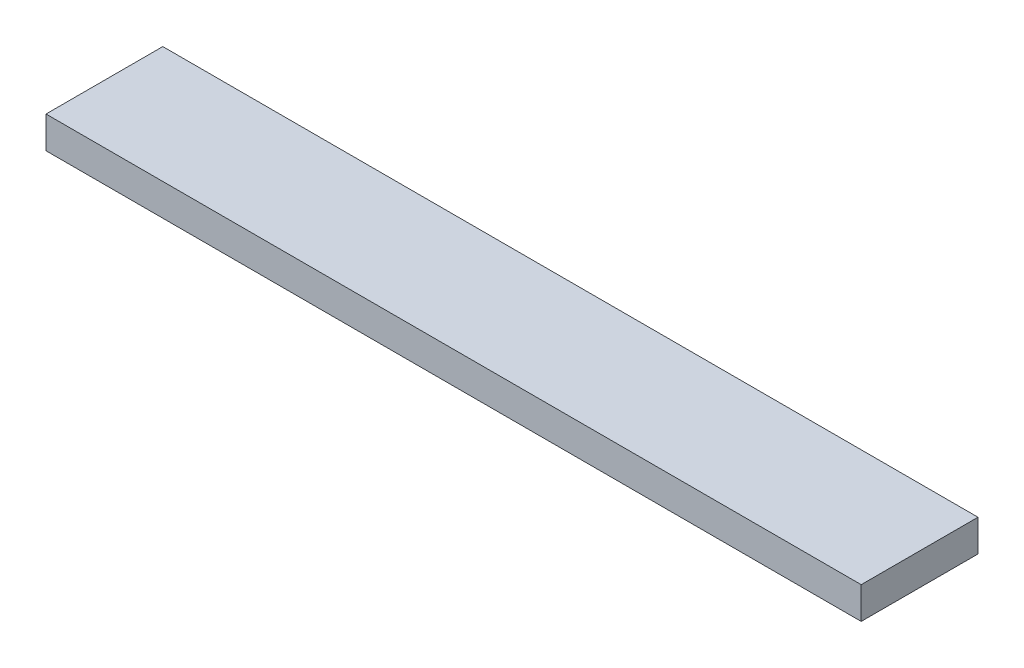
ISO-10303-21;
HEADER;
FILE_DESCRIPTION(('STEP AP214'),'2;1');
FILE_NAME('part.step','',(''),(''),'','','');
FILE_SCHEMA(('AUTOMOTIVE_DESIGN { 1 0 10303 214 1 1 1 1 }'));
ENDSEC;
DATA;
#1=APPLICATION_CONTEXT('core data for automotive mechanical design processes');
#2=APPLICATION_PROTOCOL_DEFINITION('international standard','automotive_design',2000,#1);
#3=PRODUCT_CONTEXT('',#1,'mechanical');
#4=PRODUCT('Part','Part','',(#3));
#5=PRODUCT_RELATED_PRODUCT_CATEGORY('part','',(#4));
#6=PRODUCT_DEFINITION_FORMATION('','',#4);
#7=PRODUCT_DEFINITION_CONTEXT('part definition',#1,'design');
#8=PRODUCT_DEFINITION('design','',#6,#7);
#9=PRODUCT_DEFINITION_SHAPE('','',#8);
#10=(LENGTH_UNIT() NAMED_UNIT(*) SI_UNIT(.MILLI.,.METRE.));
#11=(NAMED_UNIT(*) PLANE_ANGLE_UNIT() SI_UNIT($,.RADIAN.));
#12=(NAMED_UNIT(*) SI_UNIT($,.STERADIAN.) SOLID_ANGLE_UNIT());
#13=UNCERTAINTY_MEASURE_WITH_UNIT(LENGTH_MEASURE(1.E-05),#10,'distance_accuracy_value','');
#14=(GEOMETRIC_REPRESENTATION_CONTEXT(3) GLOBAL_UNCERTAINTY_ASSIGNED_CONTEXT((#13)) GLOBAL_UNIT_ASSIGNED_CONTEXT((#10,
#11,#12)) REPRESENTATION_CONTEXT('',''));
#15=CARTESIAN_POINT('',(0.,0.,0.));
#16=DIRECTION('',(0.,0.,1.));
#17=DIRECTION('',(1.,0.,0.));
#18=AXIS2_PLACEMENT_3D('',#15,#16,#17);
#19=CARTESIAN_POINT('',(0.,38.1,0.));
#20=DIRECTION('',(1.,0.,0.));
#21=DIRECTION('',(0.,0.,-1.));
#22=AXIS2_PLACEMENT_3D('',#19,#20,#21);
#23=PLANE('',#22);
#24=DIRECTION('',(0.,0.,1.));
#25=VECTOR('',#24,1.);
#26=CARTESIAN_POINT('',(0.,0.,0.));
#27=LINE('',#26,#25);
#28=CARTESIAN_POINT('',(0.,0.,-139.7));
#29=VERTEX_POINT('',#28);
#30=CARTESIAN_POINT('',(0.,0.,0.));
#31=VERTEX_POINT('',#30);
#32=EDGE_CURVE('E97',#29,#31,#27,.T.);
#33=ORIENTED_EDGE('',*,*,#32,.T.);
#34=DIRECTION('',(0.,-1.,0.));
#35=VECTOR('',#34,1.);
#36=CARTESIAN_POINT('',(0.,38.1,0.));
#37=LINE('',#36,#35);
#38=CARTESIAN_POINT('',(0.,38.1,0.));
#39=VERTEX_POINT('',#38);
#40=EDGE_CURVE('E11',#39,#31,#37,.T.);
#41=ORIENTED_EDGE('',*,*,#40,.F.);
#42=DIRECTION('',(0.,0.,1.));
#43=VECTOR('',#42,1.);
#44=CARTESIAN_POINT('',(0.,38.1,0.));
#45=LINE('',#44,#43);
#46=CARTESIAN_POINT('',(0.,38.1,-139.7));
#47=VERTEX_POINT('',#46);
#48=EDGE_CURVE('E85',#47,#39,#45,.T.);
#49=ORIENTED_EDGE('',*,*,#48,.F.);
#50=DIRECTION('',(0.,-1.,0.));
#51=VECTOR('',#50,1.);
#52=CARTESIAN_POINT('',(0.,38.1,-139.7));
#53=LINE('',#52,#51);
#54=EDGE_CURVE('E93',#47,#29,#53,.T.);
#55=ORIENTED_EDGE('',*,*,#54,.T.);
#56=EDGE_LOOP('',(#33,#41,#49,#55));
#57=FACE_BOUND('',#56,.T.);
#58=ADVANCED_FACE('F34',(#57),#23,.F.);
#59=CARTESIAN_POINT('',(0.,38.1,0.));
#60=DIRECTION('',(0.,0.,-1.));
#61=DIRECTION('',(-1.,0.,0.));
#62=AXIS2_PLACEMENT_3D('',#59,#60,#61);
#63=PLANE('',#62);
#64=DIRECTION('',(1.,0.,0.));
#65=VECTOR('',#64,1.);
#66=CARTESIAN_POINT('',(0.,0.,0.));
#67=LINE('',#66,#65);
#68=CARTESIAN_POINT('',(975.,0.,0.));
#69=VERTEX_POINT('',#68);
#70=EDGE_CURVE('E89',#31,#69,#67,.T.);
#71=ORIENTED_EDGE('',*,*,#70,.T.);
#72=DIRECTION('',(0.,-1.,0.));
#73=VECTOR('',#72,1.);
#74=CARTESIAN_POINT('',(975.,38.1,0.));
#75=LINE('',#74,#73);
#76=CARTESIAN_POINT('',(975.,38.1,0.));
#77=VERTEX_POINT('',#76);
#78=EDGE_CURVE('E42',#77,#69,#75,.T.);
#79=ORIENTED_EDGE('',*,*,#78,.F.);
#80=DIRECTION('',(1.,0.,0.));
#81=VECTOR('',#80,1.);
#82=CARTESIAN_POINT('',(0.,38.1,0.));
#83=LINE('',#82,#81);
#84=EDGE_CURVE('E80',#39,#77,#83,.T.);
#85=ORIENTED_EDGE('',*,*,#84,.F.);
#86=ORIENTED_EDGE('',*,*,#40,.T.);
#87=EDGE_LOOP('',(#71,#79,#85,#86));
#88=FACE_BOUND('',#87,.T.);
#89=ADVANCED_FACE('F88',(#88),#63,.F.);
#90=CARTESIAN_POINT('',(975.,38.1,0.));
#91=DIRECTION('',(-1.,0.,0.));
#92=DIRECTION('',(0.,0.,1.));
#93=AXIS2_PLACEMENT_3D('',#90,#91,#92);
#94=PLANE('',#93);
#95=DIRECTION('',(0.,0.,-1.));
#96=VECTOR('',#95,1.);
#97=CARTESIAN_POINT('',(975.,0.,0.));
#98=LINE('',#97,#96);
#99=CARTESIAN_POINT('',(975.,0.,-139.7));
#100=VERTEX_POINT('',#99);
#101=EDGE_CURVE('E67',#69,#100,#98,.T.);
#102=ORIENTED_EDGE('',*,*,#101,.T.);
#103=DIRECTION('',(0.,-1.,0.));
#104=VECTOR('',#103,1.);
#105=CARTESIAN_POINT('',(975.,38.1,-139.7));
#106=LINE('',#105,#104);
#107=CARTESIAN_POINT('',(975.,38.1,-139.7));
#108=VERTEX_POINT('',#107);
#109=EDGE_CURVE('E90',#108,#100,#106,.T.);
#110=ORIENTED_EDGE('',*,*,#109,.F.);
#111=DIRECTION('',(0.,0.,-1.));
#112=VECTOR('',#111,1.);
#113=CARTESIAN_POINT('',(975.,38.1,0.));
#114=LINE('',#113,#112);
#115=EDGE_CURVE('E83',#77,#108,#114,.T.);
#116=ORIENTED_EDGE('',*,*,#115,.F.);
#117=ORIENTED_EDGE('',*,*,#78,.T.);
#118=EDGE_LOOP('',(#102,#110,#116,#117));
#119=FACE_BOUND('',#118,.T.);
#120=ADVANCED_FACE('F91',(#119),#94,.F.);
#121=CARTESIAN_POINT('',(0.,38.1,-139.7));
#122=DIRECTION('',(0.,0.,1.));
#123=DIRECTION('',(1.,0.,0.));
#124=AXIS2_PLACEMENT_3D('',#121,#122,#123);
#125=PLANE('',#124);
#126=DIRECTION('',(-1.,0.,0.));
#127=VECTOR('',#126,1.);
#128=CARTESIAN_POINT('',(0.,0.,-139.7));
#129=LINE('',#128,#127);
#130=EDGE_CURVE('E73',#100,#29,#129,.T.);
#131=ORIENTED_EDGE('',*,*,#130,.T.);
#132=ORIENTED_EDGE('',*,*,#54,.F.);
#133=DIRECTION('',(-1.,0.,0.));
#134=VECTOR('',#133,1.);
#135=CARTESIAN_POINT('',(0.,38.1,-139.7));
#136=LINE('',#135,#134);
#137=EDGE_CURVE('E50',#108,#47,#136,.T.);
#138=ORIENTED_EDGE('',*,*,#137,.F.);
#139=ORIENTED_EDGE('',*,*,#109,.T.);
#140=EDGE_LOOP('',(#131,#132,#138,#139));
#141=FACE_BOUND('',#140,.T.);
#142=ADVANCED_FACE('F104',(#141),#125,.F.);
#143=CARTESIAN_POINT('',(0.,38.1,0.));
#144=DIRECTION('',(0.,-1.,0.));
#145=DIRECTION('',(0.,0.,-1.));
#146=AXIS2_PLACEMENT_3D('',#143,#144,#145);
#147=PLANE('',#146);
#148=ORIENTED_EDGE('',*,*,#48,.T.);
#149=ORIENTED_EDGE('',*,*,#84,.T.);
#150=ORIENTED_EDGE('',*,*,#115,.T.);
#151=ORIENTED_EDGE('',*,*,#137,.T.);
#152=EDGE_LOOP('',(#148,#149,#150,#151));
#153=FACE_BOUND('',#152,.T.);
#154=ADVANCED_FACE('F81',(#153),#147,.F.);
#155=CARTESIAN_POINT('',(0.,0.,0.));
#156=DIRECTION('',(0.,-1.,0.));
#157=DIRECTION('',(0.,0.,-1.));
#158=AXIS2_PLACEMENT_3D('',#155,#156,#157);
#159=PLANE('',#158);
#160=ORIENTED_EDGE('',*,*,#32,.F.);
#161=ORIENTED_EDGE('',*,*,#130,.F.);
#162=ORIENTED_EDGE('',*,*,#101,.F.);
#163=ORIENTED_EDGE('',*,*,#70,.F.);
#164=EDGE_LOOP('',(#160,#161,#162,#163));
#165=FACE_BOUND('',#164,.T.);
#166=ADVANCED_FACE('F107',(#165),#159,.T.);
#167=CLOSED_SHELL('',(#58,#89,#120,#142,#154,#166));
#168=MANIFOLD_SOLID_BREP('B2',#167);
#169=ADVANCED_BREP_SHAPE_REPRESENTATION('',(#18,#168),#14);
#170=SHAPE_DEFINITION_REPRESENTATION(#9,#169);
ENDSEC;
END-ISO-10303-21;
